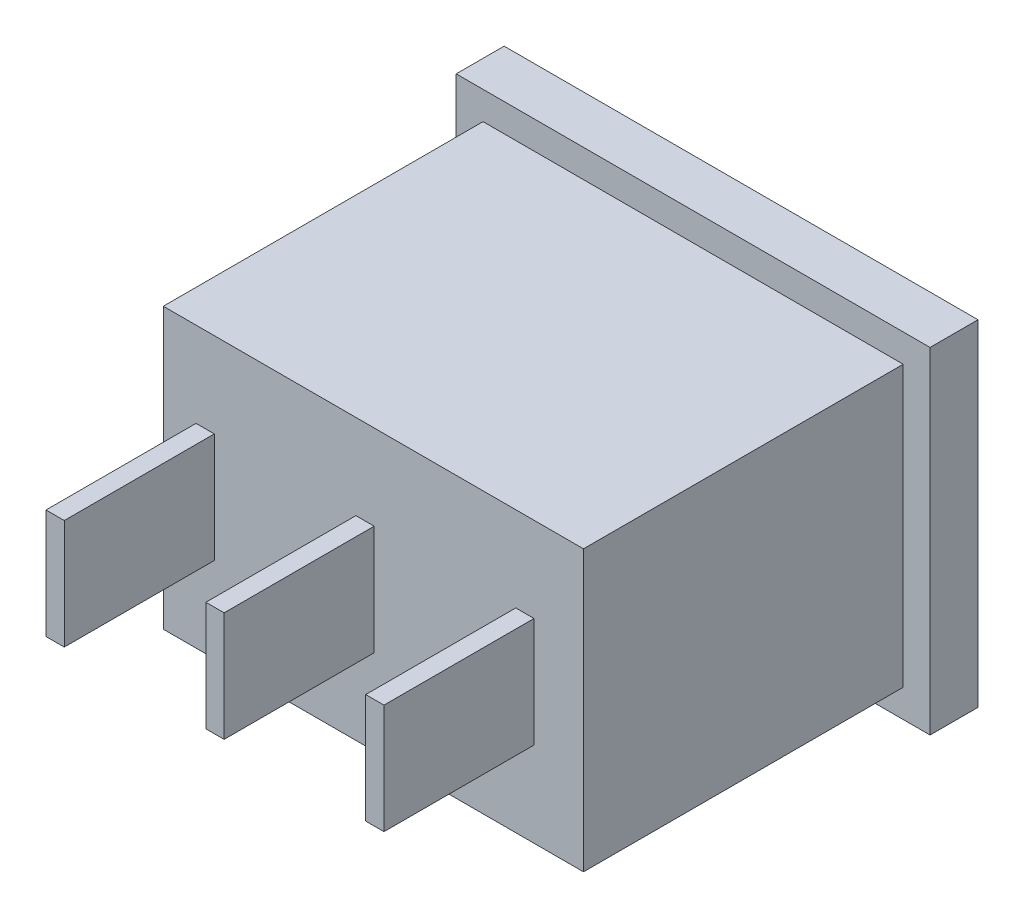
ISO-10303-21;
HEADER;
FILE_DESCRIPTION(('STEP AP214'),'2;1');
FILE_NAME('part.step','',(''),(''),'','','');
FILE_SCHEMA(('AUTOMOTIVE_DESIGN { 1 0 10303 214 1 1 1 1 }'));
ENDSEC;
DATA;
#1=APPLICATION_CONTEXT('core data for automotive mechanical design processes');
#2=APPLICATION_PROTOCOL_DEFINITION('international standard','automotive_design',2000,#1);
#3=PRODUCT_CONTEXT('',#1,'mechanical');
#4=PRODUCT('Part','Part','',(#3));
#5=PRODUCT_RELATED_PRODUCT_CATEGORY('part','',(#4));
#6=PRODUCT_DEFINITION_FORMATION('','',#4);
#7=PRODUCT_DEFINITION_CONTEXT('part definition',#1,'design');
#8=PRODUCT_DEFINITION('design','',#6,#7);
#9=PRODUCT_DEFINITION_SHAPE('','',#8);
#10=(LENGTH_UNIT() NAMED_UNIT(*) SI_UNIT(.MILLI.,.METRE.));
#11=(NAMED_UNIT(*) PLANE_ANGLE_UNIT() SI_UNIT($,.RADIAN.));
#12=(NAMED_UNIT(*) SI_UNIT($,.STERADIAN.) SOLID_ANGLE_UNIT());
#13=UNCERTAINTY_MEASURE_WITH_UNIT(LENGTH_MEASURE(1.E-05),#10,'distance_accuracy_value','');
#14=(GEOMETRIC_REPRESENTATION_CONTEXT(3) GLOBAL_UNCERTAINTY_ASSIGNED_CONTEXT((#13)) GLOBAL_UNIT_ASSIGNED_CONTEXT((#10,
#11,#12)) REPRESENTATION_CONTEXT('',''));
#15=CARTESIAN_POINT('',(0.,0.,0.));
#16=DIRECTION('',(0.,0.,1.));
#17=DIRECTION('',(1.,0.,0.));
#18=AXIS2_PLACEMENT_3D('',#15,#16,#17);
#19=CARTESIAN_POINT('',(0.,0.,0.));
#20=DIRECTION('',(0.,0.,1.));
#21=DIRECTION('',(1.,0.,0.));
#22=AXIS2_PLACEMENT_3D('',#19,#20,#21);
#23=PLANE('',#22);
#24=DIRECTION('',(0.,-1.,0.));
#25=VECTOR('',#24,1.);
#26=CARTESIAN_POINT('',(-10.375,7.35,0.));
#27=LINE('',#26,#25);
#28=CARTESIAN_POINT('',(-10.375,7.35,0.));
#29=VERTEX_POINT('',#28);
#30=CARTESIAN_POINT('',(-10.375,-7.35,0.));
#31=VERTEX_POINT('',#30);
#32=EDGE_CURVE('E342',#29,#31,#27,.T.);
#33=ORIENTED_EDGE('',*,*,#32,.F.);
#34=DIRECTION('',(-1.,0.,0.));
#35=VECTOR('',#34,1.);
#36=CARTESIAN_POINT('',(-10.375,7.35,0.));
#37=LINE('',#36,#35);
#38=CARTESIAN_POINT('',(10.375,7.35,0.));
#39=VERTEX_POINT('',#38);
#40=EDGE_CURVE('E347',#39,#29,#37,.T.);
#41=ORIENTED_EDGE('',*,*,#40,.F.);
#42=DIRECTION('',(0.,1.,0.));
#43=VECTOR('',#42,1.);
#44=CARTESIAN_POINT('',(10.375,7.35,0.));
#45=LINE('',#44,#43);
#46=CARTESIAN_POINT('',(10.375,-7.35,0.));
#47=VERTEX_POINT('',#46);
#48=EDGE_CURVE('E358',#47,#39,#45,.T.);
#49=ORIENTED_EDGE('',*,*,#48,.F.);
#50=DIRECTION('',(1.,0.,0.));
#51=VECTOR('',#50,1.);
#52=CARTESIAN_POINT('',(-10.375,-7.35,0.));
#53=LINE('',#52,#51);
#54=EDGE_CURVE('E356',#31,#47,#53,.T.);
#55=ORIENTED_EDGE('',*,*,#54,.F.);
#56=EDGE_LOOP('',(#33,#41,#49,#55));
#57=FACE_BOUND('',#56,.T.);
#58=DIRECTION('',(0.,1.,0.));
#59=VECTOR('',#58,1.);
#60=CARTESIAN_POINT('',(-7.495,-4.75,0.));
#61=LINE('',#60,#59);
#62=CARTESIAN_POINT('',(-7.495,-4.75,0.));
#63=VERTEX_POINT('',#62);
#64=CARTESIAN_POINT('',(-7.495,4.75,0.));
#65=VERTEX_POINT('',#64);
#66=EDGE_CURVE('E47',#63,#65,#61,.T.);
#67=ORIENTED_EDGE('',*,*,#66,.F.);
#68=DIRECTION('',(-1.,0.,0.));
#69=VECTOR('',#68,1.);
#70=CARTESIAN_POINT('',(-7.495,-4.75,0.));
#71=LINE('',#70,#69);
#72=CARTESIAN_POINT('',(7.495,-4.75,0.));
#73=VERTEX_POINT('',#72);
#74=EDGE_CURVE('E51',#73,#63,#71,.T.);
#75=ORIENTED_EDGE('',*,*,#74,.F.);
#76=DIRECTION('',(0.,-1.,0.));
#77=VECTOR('',#76,1.);
#78=CARTESIAN_POINT('',(7.495,-4.75,0.));
#79=LINE('',#78,#77);
#80=CARTESIAN_POINT('',(7.495,4.75,0.));
#81=VERTEX_POINT('',#80);
#82=EDGE_CURVE('E212',#81,#73,#79,.T.);
#83=ORIENTED_EDGE('',*,*,#82,.F.);
#84=DIRECTION('',(1.,0.,0.));
#85=VECTOR('',#84,1.);
#86=CARTESIAN_POINT('',(-7.495,4.75,0.));
#87=LINE('',#86,#85);
#88=EDGE_CURVE('E687',#65,#81,#87,.T.);
#89=ORIENTED_EDGE('',*,*,#88,.F.);
#90=EDGE_LOOP('',(#67,#75,#83,#89));
#91=FACE_BOUND('',#90,.T.);
#92=ADVANCED_FACE('F32',(#57,#91),#23,.F.);
#93=CARTESIAN_POINT('',(0.,0.,16.1));
#94=DIRECTION('',(0.,0.,1.));
#95=DIRECTION('',(1.,0.,0.));
#96=AXIS2_PLACEMENT_3D('',#93,#94,#95);
#97=PLANE('',#96);
#98=DIRECTION('',(0.,-1.,0.));
#99=VECTOR('',#98,1.);
#100=CARTESIAN_POINT('',(-9.2,6.125,16.1));
#101=LINE('',#100,#99);
#102=CARTESIAN_POINT('',(-9.2,6.125,16.1));
#103=VERTEX_POINT('',#102);
#104=CARTESIAN_POINT('',(-9.2,-6.125,16.1));
#105=VERTEX_POINT('',#104);
#106=EDGE_CURVE('E310',#103,#105,#101,.T.);
#107=ORIENTED_EDGE('',*,*,#106,.T.);
#108=DIRECTION('',(1.,0.,0.));
#109=VECTOR('',#108,1.);
#110=CARTESIAN_POINT('',(-9.2,-6.125,16.1));
#111=LINE('',#110,#109);
#112=CARTESIAN_POINT('',(9.2,-6.125,16.1));
#113=VERTEX_POINT('',#112);
#114=EDGE_CURVE('E313',#105,#113,#111,.T.);
#115=ORIENTED_EDGE('',*,*,#114,.T.);
#116=DIRECTION('',(0.,1.,0.));
#117=VECTOR('',#116,1.);
#118=CARTESIAN_POINT('',(9.2,6.125,16.1));
#119=LINE('',#118,#117);
#120=CARTESIAN_POINT('',(9.2,6.125,16.1));
#121=VERTEX_POINT('',#120);
#122=EDGE_CURVE('E316',#113,#121,#119,.T.);
#123=ORIENTED_EDGE('',*,*,#122,.T.);
#124=DIRECTION('',(-1.,0.,0.));
#125=VECTOR('',#124,1.);
#126=CARTESIAN_POINT('',(-9.2,6.125,16.1));
#127=LINE('',#126,#125);
#128=EDGE_CURVE('E318',#121,#103,#127,.T.);
#129=ORIENTED_EDGE('',*,*,#128,.T.);
#130=EDGE_LOOP('',(#107,#115,#123,#129));
#131=FACE_BOUND('',#130,.T.);
#132=DIRECTION('',(1.,0.,0.));
#133=VECTOR('',#132,1.);
#134=CARTESIAN_POINT('',(-0.766571113373971,-2.4,16.1));
#135=LINE('',#134,#133);
#136=CARTESIAN_POINT('',(-0.766571113373971,-2.4,16.1));
#137=VERTEX_POINT('',#136);
#138=CARTESIAN_POINT('',(0.0334288866260293,-2.4,16.1));
#139=VERTEX_POINT('',#138);
#140=EDGE_CURVE('E294',#137,#139,#135,.T.);
#141=ORIENTED_EDGE('',*,*,#140,.F.);
#142=DIRECTION('',(0.,-1.,0.));
#143=VECTOR('',#142,1.);
#144=CARTESIAN_POINT('',(-0.766571113373971,2.4,16.1));
#145=LINE('',#144,#143);
#146=CARTESIAN_POINT('',(-0.766571113373971,2.4,16.1));
#147=VERTEX_POINT('',#146);
#148=EDGE_CURVE('E280',#147,#137,#145,.T.);
#149=ORIENTED_EDGE('',*,*,#148,.F.);
#150=DIRECTION('',(-1.,0.,0.));
#151=VECTOR('',#150,1.);
#152=CARTESIAN_POINT('',(-0.766571113373971,2.4,16.1));
#153=LINE('',#152,#151);
#154=CARTESIAN_POINT('',(0.0334288866260293,2.4,16.1));
#155=VERTEX_POINT('',#154);
#156=EDGE_CURVE('E285',#155,#147,#153,.T.);
#157=ORIENTED_EDGE('',*,*,#156,.F.);
#158=DIRECTION('',(0.,1.,0.));
#159=VECTOR('',#158,1.);
#160=CARTESIAN_POINT('',(0.0334288866260293,2.4,16.1));
#161=LINE('',#160,#159);
#162=EDGE_CURVE('E296',#139,#155,#161,.T.);
#163=ORIENTED_EDGE('',*,*,#162,.F.);
#164=EDGE_LOOP('',(#141,#149,#157,#163));
#165=FACE_BOUND('',#164,.T.);
#166=DIRECTION('',(1.,0.,0.));
#167=VECTOR('',#166,1.);
#168=CARTESIAN_POINT('',(6.23342888662603,-2.4,16.1));
#169=LINE('',#168,#167);
#170=CARTESIAN_POINT('',(6.23342888662603,-2.4,16.1));
#171=VERTEX_POINT('',#170);
#172=CARTESIAN_POINT('',(7.03342888662603,-2.4,16.1));
#173=VERTEX_POINT('',#172);
#174=EDGE_CURVE('E265',#171,#173,#169,.T.);
#175=ORIENTED_EDGE('',*,*,#174,.F.);
#176=DIRECTION('',(0.,-1.,0.));
#177=VECTOR('',#176,1.);
#178=CARTESIAN_POINT('',(6.23342888662603,2.4,16.1));
#179=LINE('',#178,#177);
#180=CARTESIAN_POINT('',(6.23342888662603,2.4,16.1));
#181=VERTEX_POINT('',#180);
#182=EDGE_CURVE('E251',#181,#171,#179,.T.);
#183=ORIENTED_EDGE('',*,*,#182,.F.);
#184=DIRECTION('',(-1.,0.,0.));
#185=VECTOR('',#184,1.);
#186=CARTESIAN_POINT('',(6.23342888662603,2.4,16.1));
#187=LINE('',#186,#185);
#188=CARTESIAN_POINT('',(7.03342888662603,2.4,16.1));
#189=VERTEX_POINT('',#188);
#190=EDGE_CURVE('E256',#189,#181,#187,.T.);
#191=ORIENTED_EDGE('',*,*,#190,.F.);
#192=DIRECTION('',(0.,1.,0.));
#193=VECTOR('',#192,1.);
#194=CARTESIAN_POINT('',(7.03342888662603,2.4,16.1));
#195=LINE('',#194,#193);
#196=EDGE_CURVE('E267',#173,#189,#195,.T.);
#197=ORIENTED_EDGE('',*,*,#196,.F.);
#198=EDGE_LOOP('',(#175,#183,#191,#197));
#199=FACE_BOUND('',#198,.T.);
#200=DIRECTION('',(1.,0.,0.));
#201=VECTOR('',#200,1.);
#202=CARTESIAN_POINT('',(-7.76657111337397,-2.4,16.1));
#203=LINE('',#202,#201);
#204=CARTESIAN_POINT('',(-7.76657111337397,-2.4,16.1));
#205=VERTEX_POINT('',#204);
#206=CARTESIAN_POINT('',(-6.96657111337397,-2.4,16.1));
#207=VERTEX_POINT('',#206);
#208=EDGE_CURVE('E236',#205,#207,#203,.T.);
#209=ORIENTED_EDGE('',*,*,#208,.F.);
#210=DIRECTION('',(0.,-1.,0.));
#211=VECTOR('',#210,1.);
#212=CARTESIAN_POINT('',(-7.76657111337397,2.4,16.1));
#213=LINE('',#212,#211);
#214=CARTESIAN_POINT('',(-7.76657111337397,2.4,16.1));
#215=VERTEX_POINT('',#214);
#216=EDGE_CURVE('E222',#215,#205,#213,.T.);
#217=ORIENTED_EDGE('',*,*,#216,.F.);
#218=DIRECTION('',(-1.,0.,0.));
#219=VECTOR('',#218,1.);
#220=CARTESIAN_POINT('',(-7.76657111337397,2.4,16.1));
#221=LINE('',#220,#219);
#222=CARTESIAN_POINT('',(-6.96657111337397,2.4,16.1));
#223=VERTEX_POINT('',#222);
#224=EDGE_CURVE('E227',#223,#215,#221,.T.);
#225=ORIENTED_EDGE('',*,*,#224,.F.);
#226=DIRECTION('',(0.,1.,0.));
#227=VECTOR('',#226,1.);
#228=CARTESIAN_POINT('',(-6.96657111337397,2.4,16.1));
#229=LINE('',#228,#227);
#230=EDGE_CURVE('E238',#207,#223,#229,.T.);
#231=ORIENTED_EDGE('',*,*,#230,.F.);
#232=EDGE_LOOP('',(#209,#217,#225,#231));
#233=FACE_BOUND('',#232,.T.);
#234=ADVANCED_FACE('F392',(#131,#165,#199,#233),#97,.T.);
#235=CARTESIAN_POINT('',(-10.375,7.35,2.1));
#236=DIRECTION('',(1.,0.,0.));
#237=DIRECTION('',(0.,0.,-1.));
#238=AXIS2_PLACEMENT_3D('',#235,#236,#237);
#239=PLANE('',#238);
#240=ORIENTED_EDGE('',*,*,#32,.T.);
#241=DIRECTION('',(0.,0.,-1.));
#242=VECTOR('',#241,1.);
#243=CARTESIAN_POINT('',(-10.375,-7.35,2.1));
#244=LINE('',#243,#242);
#245=CARTESIAN_POINT('',(-10.375,-7.35,2.1));
#246=VERTEX_POINT('',#245);
#247=EDGE_CURVE('E11',#246,#31,#244,.T.);
#248=ORIENTED_EDGE('',*,*,#247,.F.);
#249=DIRECTION('',(0.,-1.,0.));
#250=VECTOR('',#249,1.);
#251=CARTESIAN_POINT('',(-10.375,7.35,2.1));
#252=LINE('',#251,#250);
#253=CARTESIAN_POINT('',(-10.375,7.35,2.1));
#254=VERTEX_POINT('',#253);
#255=EDGE_CURVE('E343',#254,#246,#252,.T.);
#256=ORIENTED_EDGE('',*,*,#255,.F.);
#257=DIRECTION('',(0.,0.,-1.));
#258=VECTOR('',#257,1.);
#259=CARTESIAN_POINT('',(-10.375,7.35,2.1));
#260=LINE('',#259,#258);
#261=EDGE_CURVE('E353',#254,#29,#260,.T.);
#262=ORIENTED_EDGE('',*,*,#261,.T.);
#263=EDGE_LOOP('',(#240,#248,#256,#262));
#264=FACE_BOUND('',#263,.T.);
#265=ADVANCED_FACE('F34',(#264),#239,.F.);
#266=CARTESIAN_POINT('',(-10.375,-7.35,2.1));
#267=DIRECTION('',(0.,1.,0.));
#268=DIRECTION('',(0.,0.,1.));
#269=AXIS2_PLACEMENT_3D('',#266,#267,#268);
#270=PLANE('',#269);
#271=ORIENTED_EDGE('',*,*,#54,.T.);
#272=DIRECTION('',(0.,0.,-1.));
#273=VECTOR('',#272,1.);
#274=CARTESIAN_POINT('',(10.375,-7.35,2.1));
#275=LINE('',#274,#273);
#276=CARTESIAN_POINT('',(10.375,-7.35,2.1));
#277=VERTEX_POINT('',#276);
#278=EDGE_CURVE('E40',#277,#47,#275,.T.);
#279=ORIENTED_EDGE('',*,*,#278,.F.);
#280=DIRECTION('',(1.,0.,0.));
#281=VECTOR('',#280,1.);
#282=CARTESIAN_POINT('',(-10.375,-7.35,2.1));
#283=LINE('',#282,#281);
#284=EDGE_CURVE('E346',#246,#277,#283,.T.);
#285=ORIENTED_EDGE('',*,*,#284,.F.);
#286=ORIENTED_EDGE('',*,*,#247,.T.);
#287=EDGE_LOOP('',(#271,#279,#285,#286));
#288=FACE_BOUND('',#287,.T.);
#289=ADVANCED_FACE('F385',(#288),#270,.F.);
#290=CARTESIAN_POINT('',(10.375,7.35,2.1));
#291=DIRECTION('',(-1.,0.,0.));
#292=DIRECTION('',(0.,0.,1.));
#293=AXIS2_PLACEMENT_3D('',#290,#291,#292);
#294=PLANE('',#293);
#295=ORIENTED_EDGE('',*,*,#48,.T.);
#296=DIRECTION('',(0.,0.,-1.));
#297=VECTOR('',#296,1.);
#298=CARTESIAN_POINT('',(10.375,7.35,2.1));
#299=LINE('',#298,#297);
#300=CARTESIAN_POINT('',(10.375,7.35,2.1));
#301=VERTEX_POINT('',#300);
#302=EDGE_CURVE('E363',#301,#39,#299,.T.);
#303=ORIENTED_EDGE('',*,*,#302,.F.);
#304=DIRECTION('',(0.,1.,0.));
#305=VECTOR('',#304,1.);
#306=CARTESIAN_POINT('',(10.375,7.35,2.1));
#307=LINE('',#306,#305);
#308=EDGE_CURVE('E349',#277,#301,#307,.T.);
#309=ORIENTED_EDGE('',*,*,#308,.F.);
#310=ORIENTED_EDGE('',*,*,#278,.T.);
#311=EDGE_LOOP('',(#295,#303,#309,#310));
#312=FACE_BOUND('',#311,.T.);
#313=ADVANCED_FACE('F370',(#312),#294,.F.);
#314=CARTESIAN_POINT('',(-10.375,7.35,2.1));
#315=DIRECTION('',(0.,-1.,0.));
#316=DIRECTION('',(0.,0.,-1.));
#317=AXIS2_PLACEMENT_3D('',#314,#315,#316);
#318=PLANE('',#317);
#319=ORIENTED_EDGE('',*,*,#40,.T.);
#320=ORIENTED_EDGE('',*,*,#261,.F.);
#321=DIRECTION('',(-1.,0.,0.));
#322=VECTOR('',#321,1.);
#323=CARTESIAN_POINT('',(-10.375,7.35,2.1));
#324=LINE('',#323,#322);
#325=EDGE_CURVE('E351',#301,#254,#324,.T.);
#326=ORIENTED_EDGE('',*,*,#325,.F.);
#327=ORIENTED_EDGE('',*,*,#302,.T.);
#328=EDGE_LOOP('',(#319,#320,#326,#327));
#329=FACE_BOUND('',#328,.T.);
#330=ADVANCED_FACE('F378',(#329),#318,.F.);
#331=CARTESIAN_POINT('',(0.,0.,2.1));
#332=DIRECTION('',(0.,0.,1.));
#333=DIRECTION('',(1.,0.,0.));
#334=AXIS2_PLACEMENT_3D('',#331,#332,#333);
#335=PLANE('',#334);
#336=DIRECTION('',(0.,-1.,0.));
#337=VECTOR('',#336,1.);
#338=CARTESIAN_POINT('',(-9.2,6.125,2.1));
#339=LINE('',#338,#337);
#340=CARTESIAN_POINT('',(-9.2,6.125,2.1));
#341=VERTEX_POINT('',#340);
#342=CARTESIAN_POINT('',(-9.2,-6.125,2.1));
#343=VERTEX_POINT('',#342);
#344=EDGE_CURVE('E309',#341,#343,#339,.T.);
#345=ORIENTED_EDGE('',*,*,#344,.F.);
#346=DIRECTION('',(-1.,0.,0.));
#347=VECTOR('',#346,1.);
#348=CARTESIAN_POINT('',(-9.2,6.125,2.1));
#349=LINE('',#348,#347);
#350=CARTESIAN_POINT('',(9.2,6.125,2.1));
#351=VERTEX_POINT('',#350);
#352=EDGE_CURVE('E314',#351,#341,#349,.T.);
#353=ORIENTED_EDGE('',*,*,#352,.F.);
#354=DIRECTION('',(0.,1.,0.));
#355=VECTOR('',#354,1.);
#356=CARTESIAN_POINT('',(9.2,6.125,2.1));
#357=LINE('',#356,#355);
#358=CARTESIAN_POINT('',(9.2,-6.125,2.1));
#359=VERTEX_POINT('',#358);
#360=EDGE_CURVE('E326',#359,#351,#357,.T.);
#361=ORIENTED_EDGE('',*,*,#360,.F.);
#362=DIRECTION('',(1.,0.,0.));
#363=VECTOR('',#362,1.);
#364=CARTESIAN_POINT('',(-9.2,-6.125,2.1));
#365=LINE('',#364,#363);
#366=EDGE_CURVE('E323',#343,#359,#365,.T.);
#367=ORIENTED_EDGE('',*,*,#366,.F.);
#368=EDGE_LOOP('',(#345,#353,#361,#367));
#369=FACE_BOUND('',#368,.T.);
#370=ORIENTED_EDGE('',*,*,#255,.T.);
#371=ORIENTED_EDGE('',*,*,#284,.T.);
#372=ORIENTED_EDGE('',*,*,#308,.T.);
#373=ORIENTED_EDGE('',*,*,#325,.T.);
#374=EDGE_LOOP('',(#370,#371,#372,#373));
#375=FACE_BOUND('',#374,.T.);
#376=ADVANCED_FACE('F384',(#369,#375),#335,.T.);
#377=CARTESIAN_POINT('',(-9.2,6.125,16.1));
#378=DIRECTION('',(1.,0.,0.));
#379=DIRECTION('',(0.,0.,-1.));
#380=AXIS2_PLACEMENT_3D('',#377,#378,#379);
#381=PLANE('',#380);
#382=ORIENTED_EDGE('',*,*,#344,.T.);
#383=DIRECTION('',(0.,0.,-1.));
#384=VECTOR('',#383,1.);
#385=CARTESIAN_POINT('',(-9.2,-6.125,16.1));
#386=LINE('',#385,#384);
#387=EDGE_CURVE('E339',#105,#343,#386,.T.);
#388=ORIENTED_EDGE('',*,*,#387,.F.);
#389=ORIENTED_EDGE('',*,*,#106,.F.);
#390=DIRECTION('',(0.,0.,-1.));
#391=VECTOR('',#390,1.);
#392=CARTESIAN_POINT('',(-9.2,6.125,16.1));
#393=LINE('',#392,#391);
#394=EDGE_CURVE('E320',#103,#341,#393,.T.);
#395=ORIENTED_EDGE('',*,*,#394,.T.);
#396=EDGE_LOOP('',(#382,#388,#389,#395));
#397=FACE_BOUND('',#396,.T.);
#398=ADVANCED_FACE('F407',(#397),#381,.F.);
#399=CARTESIAN_POINT('',(-9.2,-6.125,16.1));
#400=DIRECTION('',(0.,1.,0.));
#401=DIRECTION('',(0.,0.,1.));
#402=AXIS2_PLACEMENT_3D('',#399,#400,#401);
#403=PLANE('',#402);
#404=ORIENTED_EDGE('',*,*,#366,.T.);
#405=DIRECTION('',(0.,0.,-1.));
#406=VECTOR('',#405,1.);
#407=CARTESIAN_POINT('',(9.2,-6.125,16.1));
#408=LINE('',#407,#406);
#409=EDGE_CURVE('E336',#113,#359,#408,.T.);
#410=ORIENTED_EDGE('',*,*,#409,.F.);
#411=ORIENTED_EDGE('',*,*,#114,.F.);
#412=ORIENTED_EDGE('',*,*,#387,.T.);
#413=EDGE_LOOP('',(#404,#410,#411,#412));
#414=FACE_BOUND('',#413,.T.);
#415=ADVANCED_FACE('F412',(#414),#403,.F.);
#416=CARTESIAN_POINT('',(9.2,6.125,16.1));
#417=DIRECTION('',(-1.,0.,0.));
#418=DIRECTION('',(0.,0.,1.));
#419=AXIS2_PLACEMENT_3D('',#416,#417,#418);
#420=PLANE('',#419);
#421=ORIENTED_EDGE('',*,*,#360,.T.);
#422=DIRECTION('',(0.,0.,-1.));
#423=VECTOR('',#422,1.);
#424=CARTESIAN_POINT('',(9.2,6.125,16.1));
#425=LINE('',#424,#423);
#426=EDGE_CURVE('E333',#121,#351,#425,.T.);
#427=ORIENTED_EDGE('',*,*,#426,.F.);
#428=ORIENTED_EDGE('',*,*,#122,.F.);
#429=ORIENTED_EDGE('',*,*,#409,.T.);
#430=EDGE_LOOP('',(#421,#427,#428,#429));
#431=FACE_BOUND('',#430,.T.);
#432=ADVANCED_FACE('F425',(#431),#420,.F.);
#433=CARTESIAN_POINT('',(-9.2,6.125,16.1));
#434=DIRECTION('',(0.,-1.,0.));
#435=DIRECTION('',(0.,0.,-1.));
#436=AXIS2_PLACEMENT_3D('',#433,#434,#435);
#437=PLANE('',#436);
#438=ORIENTED_EDGE('',*,*,#352,.T.);
#439=ORIENTED_EDGE('',*,*,#394,.F.);
#440=ORIENTED_EDGE('',*,*,#128,.F.);
#441=ORIENTED_EDGE('',*,*,#426,.T.);
#442=EDGE_LOOP('',(#438,#439,#440,#441));
#443=FACE_BOUND('',#442,.T.);
#444=ADVANCED_FACE('F417',(#443),#437,.F.);
#445=CARTESIAN_POINT('',(-0.766571113373971,2.4,22.67));
#446=DIRECTION('',(1.,0.,0.));
#447=DIRECTION('',(0.,0.,-1.));
#448=AXIS2_PLACEMENT_3D('',#445,#446,#447);
#449=PLANE('',#448);
#450=ORIENTED_EDGE('',*,*,#148,.T.);
#451=DIRECTION('',(0.,0.,-1.));
#452=VECTOR('',#451,1.);
#453=CARTESIAN_POINT('',(-0.766571113373971,-2.4,22.67));
#454=LINE('',#453,#452);
#455=CARTESIAN_POINT('',(-0.766571113373971,-2.4,22.67));
#456=VERTEX_POINT('',#455);
#457=EDGE_CURVE('E307',#456,#137,#454,.T.);
#458=ORIENTED_EDGE('',*,*,#457,.F.);
#459=DIRECTION('',(0.,-1.,0.));
#460=VECTOR('',#459,1.);
#461=CARTESIAN_POINT('',(-0.766571113373971,2.4,22.67));
#462=LINE('',#461,#460);
#463=CARTESIAN_POINT('',(-0.766571113373971,2.4,22.67));
#464=VERTEX_POINT('',#463);
#465=EDGE_CURVE('E281',#464,#456,#462,.T.);
#466=ORIENTED_EDGE('',*,*,#465,.F.);
#467=DIRECTION('',(0.,0.,-1.));
#468=VECTOR('',#467,1.);
#469=CARTESIAN_POINT('',(-0.766571113373971,2.4,22.67));
#470=LINE('',#469,#468);
#471=EDGE_CURVE('E291',#464,#147,#470,.T.);
#472=ORIENTED_EDGE('',*,*,#471,.T.);
#473=EDGE_LOOP('',(#450,#458,#466,#472));
#474=FACE_BOUND('',#473,.T.);
#475=ADVANCED_FACE('F435',(#474),#449,.F.);
#476=CARTESIAN_POINT('',(-0.766571113373971,-2.4,22.67));
#477=DIRECTION('',(0.,1.,0.));
#478=DIRECTION('',(0.,0.,1.));
#479=AXIS2_PLACEMENT_3D('',#476,#477,#478);
#480=PLANE('',#479);
#481=ORIENTED_EDGE('',*,*,#140,.T.);
#482=DIRECTION('',(0.,0.,-1.));
#483=VECTOR('',#482,1.);
#484=CARTESIAN_POINT('',(0.0334288866260293,-2.4,22.67));
#485=LINE('',#484,#483);
#486=CARTESIAN_POINT('',(0.0334288866260293,-2.4,22.67));
#487=VERTEX_POINT('',#486);
#488=EDGE_CURVE('E304',#487,#139,#485,.T.);
#489=ORIENTED_EDGE('',*,*,#488,.F.);
#490=DIRECTION('',(1.,0.,0.));
#491=VECTOR('',#490,1.);
#492=CARTESIAN_POINT('',(-0.766571113373971,-2.4,22.67));
#493=LINE('',#492,#491);
#494=EDGE_CURVE('E284',#456,#487,#493,.T.);
#495=ORIENTED_EDGE('',*,*,#494,.F.);
#496=ORIENTED_EDGE('',*,*,#457,.T.);
#497=EDGE_LOOP('',(#481,#489,#495,#496));
#498=FACE_BOUND('',#497,.T.);
#499=ADVANCED_FACE('F439',(#498),#480,.F.);
#500=CARTESIAN_POINT('',(0.0334288866260293,2.4,22.67));
#501=DIRECTION('',(-1.,0.,0.));
#502=DIRECTION('',(0.,0.,1.));
#503=AXIS2_PLACEMENT_3D('',#500,#501,#502);
#504=PLANE('',#503);
#505=ORIENTED_EDGE('',*,*,#162,.T.);
#506=DIRECTION('',(0.,0.,-1.));
#507=VECTOR('',#506,1.);
#508=CARTESIAN_POINT('',(0.0334288866260293,2.4,22.67));
#509=LINE('',#508,#507);
#510=CARTESIAN_POINT('',(0.0334288866260293,2.4,22.67));
#511=VERTEX_POINT('',#510);
#512=EDGE_CURVE('E302',#511,#155,#509,.T.);
#513=ORIENTED_EDGE('',*,*,#512,.F.);
#514=DIRECTION('',(0.,1.,0.));
#515=VECTOR('',#514,1.);
#516=CARTESIAN_POINT('',(0.0334288866260293,2.4,22.67));
#517=LINE('',#516,#515);
#518=EDGE_CURVE('E287',#487,#511,#517,.T.);
#519=ORIENTED_EDGE('',*,*,#518,.F.);
#520=ORIENTED_EDGE('',*,*,#488,.T.);
#521=EDGE_LOOP('',(#505,#513,#519,#520));
#522=FACE_BOUND('',#521,.T.);
#523=ADVANCED_FACE('F443',(#522),#504,.F.);
#524=CARTESIAN_POINT('',(-0.766571113373971,2.4,22.67));
#525=DIRECTION('',(0.,-1.,0.));
#526=DIRECTION('',(0.,0.,-1.));
#527=AXIS2_PLACEMENT_3D('',#524,#525,#526);
#528=PLANE('',#527);
#529=ORIENTED_EDGE('',*,*,#156,.T.);
#530=ORIENTED_EDGE('',*,*,#471,.F.);
#531=DIRECTION('',(-1.,0.,0.));
#532=VECTOR('',#531,1.);
#533=CARTESIAN_POINT('',(-0.766571113373971,2.4,22.67));
#534=LINE('',#533,#532);
#535=EDGE_CURVE('E289',#511,#464,#534,.T.);
#536=ORIENTED_EDGE('',*,*,#535,.F.);
#537=ORIENTED_EDGE('',*,*,#512,.T.);
#538=EDGE_LOOP('',(#529,#530,#536,#537));
#539=FACE_BOUND('',#538,.T.);
#540=ADVANCED_FACE('F447',(#539),#528,.F.);
#541=CARTESIAN_POINT('',(0.,0.,22.67));
#542=DIRECTION('',(0.,0.,1.));
#543=DIRECTION('',(1.,0.,0.));
#544=AXIS2_PLACEMENT_3D('',#541,#542,#543);
#545=PLANE('',#544);
#546=ORIENTED_EDGE('',*,*,#465,.T.);
#547=ORIENTED_EDGE('',*,*,#494,.T.);
#548=ORIENTED_EDGE('',*,*,#518,.T.);
#549=ORIENTED_EDGE('',*,*,#535,.T.);
#550=EDGE_LOOP('',(#546,#547,#548,#549));
#551=FACE_BOUND('',#550,.T.);
#552=ADVANCED_FACE('F451',(#551),#545,.T.);
#553=CARTESIAN_POINT('',(6.23342888662603,2.4,22.67));
#554=DIRECTION('',(1.,0.,0.));
#555=DIRECTION('',(0.,0.,-1.));
#556=AXIS2_PLACEMENT_3D('',#553,#554,#555);
#557=PLANE('',#556);
#558=ORIENTED_EDGE('',*,*,#182,.T.);
#559=DIRECTION('',(0.,0.,-1.));
#560=VECTOR('',#559,1.);
#561=CARTESIAN_POINT('',(6.23342888662603,-2.4,22.67));
#562=LINE('',#561,#560);
#563=CARTESIAN_POINT('',(6.23342888662603,-2.4,22.67));
#564=VERTEX_POINT('',#563);
#565=EDGE_CURVE('E278',#564,#171,#562,.T.);
#566=ORIENTED_EDGE('',*,*,#565,.F.);
#567=DIRECTION('',(0.,-1.,0.));
#568=VECTOR('',#567,1.);
#569=CARTESIAN_POINT('',(6.23342888662603,2.4,22.67));
#570=LINE('',#569,#568);
#571=CARTESIAN_POINT('',(6.23342888662603,2.4,22.67));
#572=VERTEX_POINT('',#571);
#573=EDGE_CURVE('E252',#572,#564,#570,.T.);
#574=ORIENTED_EDGE('',*,*,#573,.F.);
#575=DIRECTION('',(0.,0.,-1.));
#576=VECTOR('',#575,1.);
#577=CARTESIAN_POINT('',(6.23342888662603,2.4,22.67));
#578=LINE('',#577,#576);
#579=EDGE_CURVE('E262',#572,#181,#578,.T.);
#580=ORIENTED_EDGE('',*,*,#579,.T.);
#581=EDGE_LOOP('',(#558,#566,#574,#580));
#582=FACE_BOUND('',#581,.T.);
#583=ADVANCED_FACE('F455',(#582),#557,.F.);
#584=CARTESIAN_POINT('',(6.23342888662603,-2.4,22.67));
#585=DIRECTION('',(0.,1.,0.));
#586=DIRECTION('',(0.,0.,1.));
#587=AXIS2_PLACEMENT_3D('',#584,#585,#586);
#588=PLANE('',#587);
#589=ORIENTED_EDGE('',*,*,#174,.T.);
#590=DIRECTION('',(0.,0.,-1.));
#591=VECTOR('',#590,1.);
#592=CARTESIAN_POINT('',(7.03342888662603,-2.4,22.67));
#593=LINE('',#592,#591);
#594=CARTESIAN_POINT('',(7.03342888662603,-2.4,22.67));
#595=VERTEX_POINT('',#594);
#596=EDGE_CURVE('E275',#595,#173,#593,.T.);
#597=ORIENTED_EDGE('',*,*,#596,.F.);
#598=DIRECTION('',(1.,0.,0.));
#599=VECTOR('',#598,1.);
#600=CARTESIAN_POINT('',(6.23342888662603,-2.4,22.67));
#601=LINE('',#600,#599);
#602=EDGE_CURVE('E255',#564,#595,#601,.T.);
#603=ORIENTED_EDGE('',*,*,#602,.F.);
#604=ORIENTED_EDGE('',*,*,#565,.T.);
#605=EDGE_LOOP('',(#589,#597,#603,#604));
#606=FACE_BOUND('',#605,.T.);
#607=ADVANCED_FACE('F459',(#606),#588,.F.);
#608=CARTESIAN_POINT('',(7.03342888662603,2.4,22.67));
#609=DIRECTION('',(-1.,0.,0.));
#610=DIRECTION('',(0.,0.,1.));
#611=AXIS2_PLACEMENT_3D('',#608,#609,#610);
#612=PLANE('',#611);
#613=ORIENTED_EDGE('',*,*,#196,.T.);
#614=DIRECTION('',(0.,0.,-1.));
#615=VECTOR('',#614,1.);
#616=CARTESIAN_POINT('',(7.03342888662603,2.4,22.67));
#617=LINE('',#616,#615);
#618=CARTESIAN_POINT('',(7.03342888662603,2.4,22.67));
#619=VERTEX_POINT('',#618);
#620=EDGE_CURVE('E273',#619,#189,#617,.T.);
#621=ORIENTED_EDGE('',*,*,#620,.F.);
#622=DIRECTION('',(0.,1.,0.));
#623=VECTOR('',#622,1.);
#624=CARTESIAN_POINT('',(7.03342888662603,2.4,22.67));
#625=LINE('',#624,#623);
#626=EDGE_CURVE('E258',#595,#619,#625,.T.);
#627=ORIENTED_EDGE('',*,*,#626,.F.);
#628=ORIENTED_EDGE('',*,*,#596,.T.);
#629=EDGE_LOOP('',(#613,#621,#627,#628));
#630=FACE_BOUND('',#629,.T.);
#631=ADVANCED_FACE('F463',(#630),#612,.F.);
#632=CARTESIAN_POINT('',(6.23342888662603,2.4,22.67));
#633=DIRECTION('',(0.,-1.,0.));
#634=DIRECTION('',(0.,0.,-1.));
#635=AXIS2_PLACEMENT_3D('',#632,#633,#634);
#636=PLANE('',#635);
#637=ORIENTED_EDGE('',*,*,#190,.T.);
#638=ORIENTED_EDGE('',*,*,#579,.F.);
#639=DIRECTION('',(-1.,0.,0.));
#640=VECTOR('',#639,1.);
#641=CARTESIAN_POINT('',(6.23342888662603,2.4,22.67));
#642=LINE('',#641,#640);
#643=EDGE_CURVE('E260',#619,#572,#642,.T.);
#644=ORIENTED_EDGE('',*,*,#643,.F.);
#645=ORIENTED_EDGE('',*,*,#620,.T.);
#646=EDGE_LOOP('',(#637,#638,#644,#645));
#647=FACE_BOUND('',#646,.T.);
#648=ADVANCED_FACE('F467',(#647),#636,.F.);
#649=CARTESIAN_POINT('',(0.,0.,22.67));
#650=DIRECTION('',(0.,0.,1.));
#651=DIRECTION('',(1.,0.,0.));
#652=AXIS2_PLACEMENT_3D('',#649,#650,#651);
#653=PLANE('',#652);
#654=ORIENTED_EDGE('',*,*,#573,.T.);
#655=ORIENTED_EDGE('',*,*,#602,.T.);
#656=ORIENTED_EDGE('',*,*,#626,.T.);
#657=ORIENTED_EDGE('',*,*,#643,.T.);
#658=EDGE_LOOP('',(#654,#655,#656,#657));
#659=FACE_BOUND('',#658,.T.);
#660=ADVANCED_FACE('F471',(#659),#653,.T.);
#661=CARTESIAN_POINT('',(-7.76657111337397,2.4,22.67));
#662=DIRECTION('',(1.,0.,0.));
#663=DIRECTION('',(0.,0.,-1.));
#664=AXIS2_PLACEMENT_3D('',#661,#662,#663);
#665=PLANE('',#664);
#666=ORIENTED_EDGE('',*,*,#216,.T.);
#667=DIRECTION('',(0.,0.,-1.));
#668=VECTOR('',#667,1.);
#669=CARTESIAN_POINT('',(-7.76657111337397,-2.4,22.67));
#670=LINE('',#669,#668);
#671=CARTESIAN_POINT('',(-7.76657111337397,-2.4,22.67));
#672=VERTEX_POINT('',#671);
#673=EDGE_CURVE('E249',#672,#205,#670,.T.);
#674=ORIENTED_EDGE('',*,*,#673,.F.);
#675=DIRECTION('',(0.,-1.,0.));
#676=VECTOR('',#675,1.);
#677=CARTESIAN_POINT('',(-7.76657111337397,2.4,22.67));
#678=LINE('',#677,#676);
#679=CARTESIAN_POINT('',(-7.76657111337397,2.4,22.67));
#680=VERTEX_POINT('',#679);
#681=EDGE_CURVE('E223',#680,#672,#678,.T.);
#682=ORIENTED_EDGE('',*,*,#681,.F.);
#683=DIRECTION('',(0.,0.,-1.));
#684=VECTOR('',#683,1.);
#685=CARTESIAN_POINT('',(-7.76657111337397,2.4,22.67));
#686=LINE('',#685,#684);
#687=EDGE_CURVE('E233',#680,#215,#686,.T.);
#688=ORIENTED_EDGE('',*,*,#687,.T.);
#689=EDGE_LOOP('',(#666,#674,#682,#688));
#690=FACE_BOUND('',#689,.T.);
#691=ADVANCED_FACE('F475',(#690),#665,.F.);
#692=CARTESIAN_POINT('',(-7.76657111337397,-2.4,22.67));
#693=DIRECTION('',(0.,1.,0.));
#694=DIRECTION('',(0.,0.,1.));
#695=AXIS2_PLACEMENT_3D('',#692,#693,#694);
#696=PLANE('',#695);
#697=ORIENTED_EDGE('',*,*,#208,.T.);
#698=DIRECTION('',(0.,0.,-1.));
#699=VECTOR('',#698,1.);
#700=CARTESIAN_POINT('',(-6.96657111337397,-2.4,22.67));
#701=LINE('',#700,#699);
#702=CARTESIAN_POINT('',(-6.96657111337397,-2.4,22.67));
#703=VERTEX_POINT('',#702);
#704=EDGE_CURVE('E246',#703,#207,#701,.T.);
#705=ORIENTED_EDGE('',*,*,#704,.F.);
#706=DIRECTION('',(1.,0.,0.));
#707=VECTOR('',#706,1.);
#708=CARTESIAN_POINT('',(-7.76657111337397,-2.4,22.67));
#709=LINE('',#708,#707);
#710=EDGE_CURVE('E226',#672,#703,#709,.T.);
#711=ORIENTED_EDGE('',*,*,#710,.F.);
#712=ORIENTED_EDGE('',*,*,#673,.T.);
#713=EDGE_LOOP('',(#697,#705,#711,#712));
#714=FACE_BOUND('',#713,.T.);
#715=ADVANCED_FACE('F479',(#714),#696,.F.);
#716=CARTESIAN_POINT('',(-6.96657111337397,2.4,22.67));
#717=DIRECTION('',(-1.,0.,0.));
#718=DIRECTION('',(0.,-1.,0.));
#719=AXIS2_PLACEMENT_3D('',#716,#717,#718);
#720=PLANE('',#719);
#721=ORIENTED_EDGE('',*,*,#230,.T.);
#722=DIRECTION('',(0.,0.,-1.));
#723=VECTOR('',#722,1.);
#724=CARTESIAN_POINT('',(-6.96657111337397,2.4,22.67));
#725=LINE('',#724,#723);
#726=CARTESIAN_POINT('',(-6.96657111337397,2.4,22.67));
#727=VERTEX_POINT('',#726);
#728=EDGE_CURVE('E244',#727,#223,#725,.T.);
#729=ORIENTED_EDGE('',*,*,#728,.F.);
#730=DIRECTION('',(0.,1.,0.));
#731=VECTOR('',#730,1.);
#732=CARTESIAN_POINT('',(-6.96657111337397,2.4,22.67));
#733=LINE('',#732,#731);
#734=EDGE_CURVE('E229',#703,#727,#733,.T.);
#735=ORIENTED_EDGE('',*,*,#734,.F.);
#736=ORIENTED_EDGE('',*,*,#704,.T.);
#737=EDGE_LOOP('',(#721,#729,#735,#736));
#738=FACE_BOUND('',#737,.T.);
#739=ADVANCED_FACE('F483',(#738),#720,.F.);
#740=CARTESIAN_POINT('',(-7.76657111337397,2.4,22.67));
#741=DIRECTION('',(0.,-1.,0.));
#742=DIRECTION('',(1.,0.,0.));
#743=AXIS2_PLACEMENT_3D('',#740,#741,#742);
#744=PLANE('',#743);
#745=ORIENTED_EDGE('',*,*,#224,.T.);
#746=ORIENTED_EDGE('',*,*,#687,.F.);
#747=DIRECTION('',(-1.,0.,0.));
#748=VECTOR('',#747,1.);
#749=CARTESIAN_POINT('',(-7.76657111337397,2.4,22.67));
#750=LINE('',#749,#748);
#751=EDGE_CURVE('E231',#727,#680,#750,.T.);
#752=ORIENTED_EDGE('',*,*,#751,.F.);
#753=ORIENTED_EDGE('',*,*,#728,.T.);
#754=EDGE_LOOP('',(#745,#746,#752,#753));
#755=FACE_BOUND('',#754,.T.);
#756=ADVANCED_FACE('F487',(#755),#744,.F.);
#757=CARTESIAN_POINT('',(0.,0.,22.67));
#758=DIRECTION('',(0.,0.,1.));
#759=DIRECTION('',(1.,0.,0.));
#760=AXIS2_PLACEMENT_3D('',#757,#758,#759);
#761=PLANE('',#760);
#762=ORIENTED_EDGE('',*,*,#681,.T.);
#763=ORIENTED_EDGE('',*,*,#710,.T.);
#764=ORIENTED_EDGE('',*,*,#734,.T.);
#765=ORIENTED_EDGE('',*,*,#751,.T.);
#766=EDGE_LOOP('',(#762,#763,#764,#765));
#767=FACE_BOUND('',#766,.T.);
#768=ADVANCED_FACE('F491',(#767),#761,.T.);
#769=CARTESIAN_POINT('',(-7.495,-4.75,-2.));
#770=DIRECTION('',(1.,0.,0.));
#771=DIRECTION('',(0.,0.,-1.));
#772=AXIS2_PLACEMENT_3D('',#769,#770,#771);
#773=PLANE('',#772);
#774=ORIENTED_EDGE('',*,*,#66,.T.);
#775=DIRECTION('',(0.,0.,1.));
#776=VECTOR('',#775,1.);
#777=CARTESIAN_POINT('',(-7.495,4.75,-2.));
#778=LINE('',#777,#776);
#779=CARTESIAN_POINT('',(-7.495,4.75,-2.));
#780=VERTEX_POINT('',#779);
#781=EDGE_CURVE('E215',#780,#65,#778,.T.);
#782=ORIENTED_EDGE('',*,*,#781,.F.);
#783=DIRECTION('',(0.,1.,0.));
#784=VECTOR('',#783,1.);
#785=CARTESIAN_POINT('',(-7.495,-4.75,-2.));
#786=LINE('',#785,#784);
#787=CARTESIAN_POINT('',(-7.495,-4.75,-2.));
#788=VERTEX_POINT('',#787);
#789=EDGE_CURVE('E202',#788,#780,#786,.T.);
#790=ORIENTED_EDGE('',*,*,#789,.F.);
#791=DIRECTION('',(0.,0.,1.));
#792=VECTOR('',#791,1.);
#793=CARTESIAN_POINT('',(-7.495,-4.75,-2.));
#794=LINE('',#793,#792);
#795=EDGE_CURVE('E201',#788,#63,#794,.T.);
#796=ORIENTED_EDGE('',*,*,#795,.T.);
#797=EDGE_LOOP('',(#774,#782,#790,#796));
#798=FACE_BOUND('',#797,.T.);
#799=ADVANCED_FACE('F495',(#798),#773,.F.);
#800=CARTESIAN_POINT('',(-7.495,4.75,-2.));
#801=DIRECTION('',(0.,-1.,0.));
#802=DIRECTION('',(0.,0.,-1.));
#803=AXIS2_PLACEMENT_3D('',#800,#801,#802);
#804=PLANE('',#803);
#805=DIRECTION('',(0.,0.,1.));
#806=VECTOR('',#805,1.);
#807=CARTESIAN_POINT('',(7.495,4.75,-2.));
#808=LINE('',#807,#806);
#809=CARTESIAN_POINT('',(7.495,4.75,-2.));
#810=VERTEX_POINT('',#809);
#811=EDGE_CURVE('E213',#810,#81,#808,.T.);
#812=ORIENTED_EDGE('',*,*,#811,.F.);
#813=CARTESIAN_POINT('',(0.,4.75,-26.));
#814=DIRECTION('',(0.,1.,0.));
#815=DIRECTION('',(0.,0.,1.));
#816=AXIS2_PLACEMENT_3D('',#813,#814,#815);
#817=CIRCLE('',#816,25.1430909993183);
#818=EDGE_CURVE('E196',#780,#810,#817,.T.);
#819=ORIENTED_EDGE('',*,*,#818,.F.);
#820=ORIENTED_EDGE('',*,*,#781,.T.);
#821=ORIENTED_EDGE('',*,*,#88,.T.);
#822=EDGE_LOOP('',(#812,#819,#820,#821));
#823=FACE_BOUND('',#822,.T.);
#824=ADVANCED_FACE('F499',(#823),#804,.F.);
#825=CARTESIAN_POINT('',(7.495,-4.75,-2.));
#826=DIRECTION('',(-1.,0.,0.));
#827=DIRECTION('',(0.,0.,1.));
#828=AXIS2_PLACEMENT_3D('',#825,#826,#827);
#829=PLANE('',#828);
#830=ORIENTED_EDGE('',*,*,#82,.T.);
#831=DIRECTION('',(0.,0.,1.));
#832=VECTOR('',#831,1.);
#833=CARTESIAN_POINT('',(7.495,-4.75,-2.));
#834=LINE('',#833,#832);
#835=CARTESIAN_POINT('',(7.495,-4.75,-2.));
#836=VERTEX_POINT('',#835);
#837=EDGE_CURVE('E207',#836,#73,#834,.T.);
#838=ORIENTED_EDGE('',*,*,#837,.F.);
#839=DIRECTION('',(0.,-1.,0.));
#840=VECTOR('',#839,1.);
#841=CARTESIAN_POINT('',(7.495,-4.75,-2.));
#842=LINE('',#841,#840);
#843=EDGE_CURVE('E190',#810,#836,#842,.T.);
#844=ORIENTED_EDGE('',*,*,#843,.F.);
#845=ORIENTED_EDGE('',*,*,#811,.T.);
#846=EDGE_LOOP('',(#830,#838,#844,#845));
#847=FACE_BOUND('',#846,.T.);
#848=ADVANCED_FACE('F211',(#847),#829,.F.);
#849=CARTESIAN_POINT('',(-7.495,-4.75,-2.));
#850=DIRECTION('',(0.,1.,0.));
#851=DIRECTION('',(0.,0.,1.));
#852=AXIS2_PLACEMENT_3D('',#849,#850,#851);
#853=PLANE('',#852);
#854=ORIENTED_EDGE('',*,*,#795,.F.);
#855=CARTESIAN_POINT('',(0.,-4.75,-26.));
#856=DIRECTION('',(0.,1.,0.));
#857=DIRECTION('',(0.,0.,1.));
#858=AXIS2_PLACEMENT_3D('',#855,#856,#857);
#859=CIRCLE('',#858,25.1430909993183);
#860=EDGE_CURVE('E193',#836,#788,#859,.F.);
#861=ORIENTED_EDGE('',*,*,#860,.F.);
#862=ORIENTED_EDGE('',*,*,#837,.T.);
#863=ORIENTED_EDGE('',*,*,#74,.T.);
#864=EDGE_LOOP('',(#854,#861,#862,#863));
#865=FACE_BOUND('',#864,.T.);
#866=ADVANCED_FACE('F206',(#865),#853,.F.);
#867=CARTESIAN_POINT('',(0.,-7.351,-26.));
#868=DIRECTION('',(0.,1.,0.));
#869=DIRECTION('',(0.,0.,1.));
#870=AXIS2_PLACEMENT_3D('',#867,#868,#869);
#871=CYLINDRICAL_SURFACE('',#870,25.1430909993183);
#872=ORIENTED_EDGE('',*,*,#860,.T.);
#873=ORIENTED_EDGE('',*,*,#789,.T.);
#874=ORIENTED_EDGE('',*,*,#818,.T.);
#875=ORIENTED_EDGE('',*,*,#843,.T.);
#876=EDGE_LOOP('',(#872,#873,#874,#875));
#877=FACE_BOUND('',#876,.T.);
#878=ADVANCED_FACE('F192',(#877),#871,.F.);
#879=CLOSED_SHELL('',(#92,#234,#265,#289,#313,#330,#376,#398,#415,#432,#444,#475,#499,#523,#540,
#552,#583,#607,#631,#648,#660,#691,#715,#739,#756,#768,#799,#824,#848,#866,#878));
#880=MANIFOLD_SOLID_BREP('B2',#879);
#881=ADVANCED_BREP_SHAPE_REPRESENTATION('',(#18,#880),#14);
#882=SHAPE_DEFINITION_REPRESENTATION(#9,#881);
ENDSEC;
END-ISO-10303-21;
